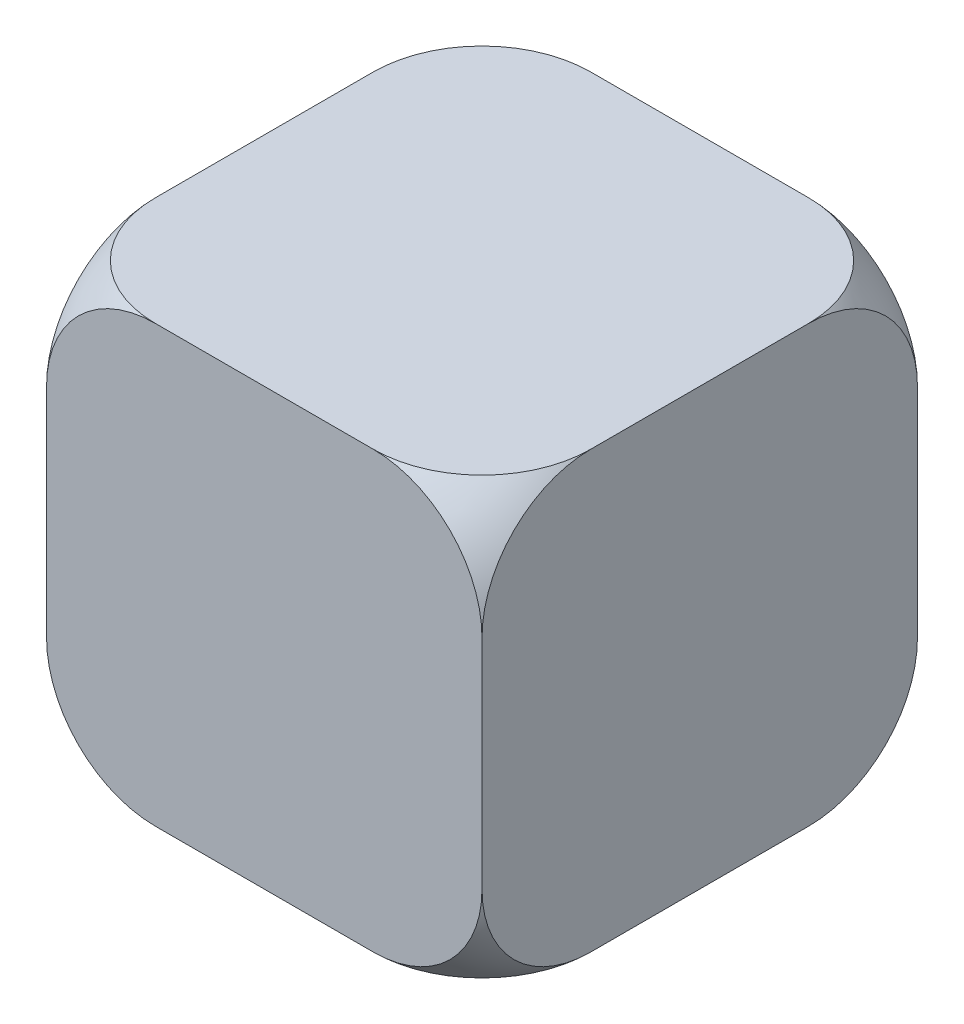
ISO-10303-21;
HEADER;
FILE_DESCRIPTION(('STEP AP214'),'2;1');
FILE_NAME('part.step','',(''),(''),'','','');
FILE_SCHEMA(('AUTOMOTIVE_DESIGN { 1 0 10303 214 1 1 1 1 }'));
ENDSEC;
DATA;
#1=APPLICATION_CONTEXT('core data for automotive mechanical design processes');
#2=APPLICATION_PROTOCOL_DEFINITION('international standard','automotive_design',2000,#1);
#3=PRODUCT_CONTEXT('',#1,'mechanical');
#4=PRODUCT('Part','Part','',(#3));
#5=PRODUCT_RELATED_PRODUCT_CATEGORY('part','',(#4));
#6=PRODUCT_DEFINITION_FORMATION('','',#4);
#7=PRODUCT_DEFINITION_CONTEXT('part definition',#1,'design');
#8=PRODUCT_DEFINITION('design','',#6,#7);
#9=PRODUCT_DEFINITION_SHAPE('','',#8);
#10=(LENGTH_UNIT() NAMED_UNIT(*) SI_UNIT(.MILLI.,.METRE.));
#11=(NAMED_UNIT(*) PLANE_ANGLE_UNIT() SI_UNIT($,.RADIAN.));
#12=(NAMED_UNIT(*) SI_UNIT($,.STERADIAN.) SOLID_ANGLE_UNIT());
#13=UNCERTAINTY_MEASURE_WITH_UNIT(LENGTH_MEASURE(1.E-05),#10,'distance_accuracy_value','');
#14=(GEOMETRIC_REPRESENTATION_CONTEXT(3) GLOBAL_UNCERTAINTY_ASSIGNED_CONTEXT((#13)) GLOBAL_UNIT_ASSIGNED_CONTEXT((#10,
#11,#12)) REPRESENTATION_CONTEXT('',''));
#15=CARTESIAN_POINT('',(0.,0.,0.));
#16=DIRECTION('',(0.,0.,1.));
#17=DIRECTION('',(1.,0.,0.));
#18=AXIS2_PLACEMENT_3D('',#15,#16,#17);
#19=CARTESIAN_POINT('',(0.,0.,-1.03553390593274));
#20=DIRECTION('',(-1.,0.,0.));
#21=DIRECTION('',(0.,-1.,0.));
#22=AXIS2_PLACEMENT_3D('',#19,#20,#21);
#23=PLANE('',#22);
#24=DIRECTION('',(0.,-1.,0.));
#25=VECTOR('',#24,1.);
#26=CARTESIAN_POINT('',(0.,7.5,0.));
#27=LINE('',#26,#25);
#28=CARTESIAN_POINT('',(0.,7.5,0.));
#29=VERTEX_POINT('',#28);
#30=CARTESIAN_POINT('',(0.,2.5,0.));
#31=VERTEX_POINT('',#30);
#32=EDGE_CURVE('E119',#29,#31,#27,.T.);
#33=ORIENTED_EDGE('',*,*,#32,.T.);
#34=CARTESIAN_POINT('',(0.,2.5,2.5));
#35=DIRECTION('',(-1.,0.,0.));
#36=DIRECTION('',(0.,-1.,0.));
#37=AXIS2_PLACEMENT_3D('',#34,#35,#36);
#38=CIRCLE('',#37,2.5);
#39=CARTESIAN_POINT('',(0.,0.,2.5));
#40=VERTEX_POINT('',#39);
#41=EDGE_CURVE('E102',#31,#40,#38,.T.);
#42=ORIENTED_EDGE('',*,*,#41,.T.);
#43=DIRECTION('',(0.,0.,-1.));
#44=VECTOR('',#43,1.);
#45=CARTESIAN_POINT('',(0.,0.,7.5));
#46=LINE('',#45,#44);
#47=CARTESIAN_POINT('',(0.,0.,7.5));
#48=VERTEX_POINT('',#47);
#49=EDGE_CURVE('E48',#48,#40,#46,.T.);
#50=ORIENTED_EDGE('',*,*,#49,.F.);
#51=CARTESIAN_POINT('',(0.,2.5,7.5));
#52=DIRECTION('',(-1.,0.,0.));
#53=DIRECTION('',(0.,-1.,0.));
#54=AXIS2_PLACEMENT_3D('',#51,#52,#53);
#55=CIRCLE('',#54,2.5);
#56=CARTESIAN_POINT('',(0.,2.5,10.));
#57=VERTEX_POINT('',#56);
#58=EDGE_CURVE('E225',#48,#57,#55,.T.);
#59=ORIENTED_EDGE('',*,*,#58,.T.);
#60=DIRECTION('',(0.,-1.,0.));
#61=VECTOR('',#60,1.);
#62=CARTESIAN_POINT('',(0.,7.5,10.));
#63=LINE('',#62,#61);
#64=CARTESIAN_POINT('',(0.,7.5,10.));
#65=VERTEX_POINT('',#64);
#66=EDGE_CURVE('E180',#65,#57,#63,.T.);
#67=ORIENTED_EDGE('',*,*,#66,.F.);
#68=CARTESIAN_POINT('',(0.,7.5,7.5));
#69=DIRECTION('',(-1.,0.,0.));
#70=DIRECTION('',(0.,-1.,0.));
#71=AXIS2_PLACEMENT_3D('',#68,#69,#70);
#72=CIRCLE('',#71,2.5);
#73=CARTESIAN_POINT('',(0.,10.,7.5));
#74=VERTEX_POINT('',#73);
#75=EDGE_CURVE('E210',#65,#74,#72,.T.);
#76=ORIENTED_EDGE('',*,*,#75,.T.);
#77=DIRECTION('',(0.,0.,-1.));
#78=VECTOR('',#77,1.);
#79=CARTESIAN_POINT('',(0.,10.,7.5));
#80=LINE('',#79,#78);
#81=CARTESIAN_POINT('',(0.,10.,2.5));
#82=VERTEX_POINT('',#81);
#83=EDGE_CURVE('E95',#74,#82,#80,.T.);
#84=ORIENTED_EDGE('',*,*,#83,.T.);
#85=CARTESIAN_POINT('',(0.,7.5,2.5));
#86=DIRECTION('',(-1.,0.,0.));
#87=DIRECTION('',(0.,-1.,0.));
#88=AXIS2_PLACEMENT_3D('',#85,#86,#87);
#89=CIRCLE('',#88,2.5);
#90=EDGE_CURVE('E215',#82,#29,#89,.T.);
#91=ORIENTED_EDGE('',*,*,#90,.T.);
#92=EDGE_LOOP('',(#33,#42,#50,#59,#67,#76,#84,#91));
#93=FACE_BOUND('',#92,.T.);
#94=ADVANCED_FACE('F33',(#93),#23,.T.);
#95=CARTESIAN_POINT('',(0.,0.,-1.03553390593274));
#96=DIRECTION('',(0.,-1.,0.));
#97=DIRECTION('',(1.,0.,0.));
#98=AXIS2_PLACEMENT_3D('',#95,#96,#97);
#99=PLANE('',#98);
#100=CARTESIAN_POINT('',(2.5,0.,2.5));
#101=DIRECTION('',(0.,-1.,0.));
#102=DIRECTION('',(1.,0.,0.));
#103=AXIS2_PLACEMENT_3D('',#100,#101,#102);
#104=CIRCLE('',#103,2.5);
#105=CARTESIAN_POINT('',(2.5,0.,0.));
#106=VERTEX_POINT('',#105);
#107=EDGE_CURVE('E41',#40,#106,#104,.T.);
#108=ORIENTED_EDGE('',*,*,#107,.T.);
#109=DIRECTION('',(-1.,0.,0.));
#110=VECTOR('',#109,1.);
#111=CARTESIAN_POINT('',(7.5,0.,0.));
#112=LINE('',#111,#110);
#113=CARTESIAN_POINT('',(7.5,0.,0.));
#114=VERTEX_POINT('',#113);
#115=EDGE_CURVE('E86',#114,#106,#112,.T.);
#116=ORIENTED_EDGE('',*,*,#115,.F.);
#117=CARTESIAN_POINT('',(7.5,0.,2.5));
#118=DIRECTION('',(0.,-1.,0.));
#119=DIRECTION('',(1.,0.,0.));
#120=AXIS2_PLACEMENT_3D('',#117,#118,#119);
#121=CIRCLE('',#120,2.49999999999999);
#122=CARTESIAN_POINT('',(9.99999999999999,0.,2.5));
#123=VERTEX_POINT('',#122);
#124=EDGE_CURVE('E71',#114,#123,#121,.T.);
#125=ORIENTED_EDGE('',*,*,#124,.T.);
#126=DIRECTION('',(0.,0.,-1.));
#127=VECTOR('',#126,1.);
#128=CARTESIAN_POINT('',(9.99999999999999,0.,7.5));
#129=LINE('',#128,#127);
#130=CARTESIAN_POINT('',(10.,0.,7.5));
#131=VERTEX_POINT('',#130);
#132=EDGE_CURVE('E83',#131,#123,#129,.T.);
#133=ORIENTED_EDGE('',*,*,#132,.F.);
#134=CARTESIAN_POINT('',(7.5,0.,7.5));
#135=DIRECTION('',(0.,-1.,0.));
#136=DIRECTION('',(1.,0.,0.));
#137=AXIS2_PLACEMENT_3D('',#134,#135,#136);
#138=CIRCLE('',#137,2.49999999999999);
#139=CARTESIAN_POINT('',(7.5,0.,10.));
#140=VERTEX_POINT('',#139);
#141=EDGE_CURVE('E173',#131,#140,#138,.T.);
#142=ORIENTED_EDGE('',*,*,#141,.T.);
#143=DIRECTION('',(-1.,0.,0.));
#144=VECTOR('',#143,1.);
#145=CARTESIAN_POINT('',(7.5,0.,10.));
#146=LINE('',#145,#144);
#147=CARTESIAN_POINT('',(2.5,0.,10.));
#148=VERTEX_POINT('',#147);
#149=EDGE_CURVE('E171',#140,#148,#146,.T.);
#150=ORIENTED_EDGE('',*,*,#149,.T.);
#151=CARTESIAN_POINT('',(2.5,0.,7.5));
#152=DIRECTION('',(0.,-1.,0.));
#153=DIRECTION('',(1.,0.,0.));
#154=AXIS2_PLACEMENT_3D('',#151,#152,#153);
#155=CIRCLE('',#154,2.5);
#156=EDGE_CURVE('E176',#148,#48,#155,.T.);
#157=ORIENTED_EDGE('',*,*,#156,.T.);
#158=ORIENTED_EDGE('',*,*,#49,.T.);
#159=EDGE_LOOP('',(#108,#116,#125,#133,#142,#150,#157,#158));
#160=FACE_BOUND('',#159,.T.);
#161=ADVANCED_FACE('F35',(#160),#99,.T.);
#162=CARTESIAN_POINT('',(2.5,2.5,2.5));
#163=DIRECTION('',(1.,0.,0.));
#164=DIRECTION('',(0.,-1.,0.));
#165=AXIS2_PLACEMENT_3D('',#162,#163,#164);
#166=SPHERICAL_SURFACE('',#165,3.53553390593274);
#167=ORIENTED_EDGE('',*,*,#41,.F.);
#168=CARTESIAN_POINT('',(2.5,2.50000000000001,0.));
#169=DIRECTION('',(0.,0.,1.));
#170=DIRECTION('',(0.,-1.,0.));
#171=AXIS2_PLACEMENT_3D('',#168,#169,#170);
#172=CIRCLE('',#171,2.5);
#173=EDGE_CURVE('E11',#31,#106,#172,.T.);
#174=ORIENTED_EDGE('',*,*,#173,.T.);
#175=ORIENTED_EDGE('',*,*,#107,.F.);
#176=EDGE_LOOP('',(#167,#174,#175));
#177=FACE_BOUND('',#176,.T.);
#178=ADVANCED_FACE('F110',(#177),#166,.T.);
#179=CARTESIAN_POINT('',(20.,0.,0.));
#180=DIRECTION('',(0.,0.,1.));
#181=DIRECTION('',(0.,-1.,0.));
#182=AXIS2_PLACEMENT_3D('',#179,#180,#181);
#183=PLANE('',#182);
#184=ORIENTED_EDGE('',*,*,#173,.F.);
#185=ORIENTED_EDGE('',*,*,#32,.F.);
#186=CARTESIAN_POINT('',(2.5,7.49999999999999,0.));
#187=DIRECTION('',(0.,0.,1.));
#188=DIRECTION('',(0.,-1.,0.));
#189=AXIS2_PLACEMENT_3D('',#186,#187,#188);
#190=CIRCLE('',#189,2.5);
#191=CARTESIAN_POINT('',(2.5,10.,0.));
#192=VERTEX_POINT('',#191);
#193=EDGE_CURVE('E220',#192,#29,#190,.T.);
#194=ORIENTED_EDGE('',*,*,#193,.F.);
#195=DIRECTION('',(-1.,0.,0.));
#196=VECTOR('',#195,1.);
#197=CARTESIAN_POINT('',(7.5,10.,0.));
#198=LINE('',#197,#196);
#199=CARTESIAN_POINT('',(7.5,10.,0.));
#200=VERTEX_POINT('',#199);
#201=EDGE_CURVE('E189',#200,#192,#198,.T.);
#202=ORIENTED_EDGE('',*,*,#201,.F.);
#203=CARTESIAN_POINT('',(7.5,7.49999999999999,0.));
#204=DIRECTION('',(0.,0.,1.));
#205=DIRECTION('',(0.,-1.,0.));
#206=AXIS2_PLACEMENT_3D('',#203,#204,#205);
#207=CIRCLE('',#206,2.5);
#208=CARTESIAN_POINT('',(10.,7.5,0.));
#209=VERTEX_POINT('',#208);
#210=EDGE_CURVE('E199',#209,#200,#207,.T.);
#211=ORIENTED_EDGE('',*,*,#210,.F.);
#212=DIRECTION('',(0.,-1.,0.));
#213=VECTOR('',#212,1.);
#214=CARTESIAN_POINT('',(10.,7.5,0.));
#215=LINE('',#214,#213);
#216=CARTESIAN_POINT('',(10.,2.5,0.));
#217=VERTEX_POINT('',#216);
#218=EDGE_CURVE('E185',#209,#217,#215,.T.);
#219=ORIENTED_EDGE('',*,*,#218,.T.);
#220=CARTESIAN_POINT('',(7.5,2.50000000000001,0.));
#221=DIRECTION('',(0.,0.,1.));
#222=DIRECTION('',(0.,-1.,0.));
#223=AXIS2_PLACEMENT_3D('',#220,#221,#222);
#224=CIRCLE('',#223,2.5);
#225=EDGE_CURVE('E73',#114,#217,#224,.T.);
#226=ORIENTED_EDGE('',*,*,#225,.F.);
#227=ORIENTED_EDGE('',*,*,#115,.T.);
#228=EDGE_LOOP('',(#184,#185,#194,#202,#211,#219,#226,#227));
#229=FACE_BOUND('',#228,.T.);
#230=ADVANCED_FACE('F115',(#229),#183,.F.);
#231=CARTESIAN_POINT('',(9.99999999999999,10.,7.5));
#232=DIRECTION('',(-1.,0.,0.));
#233=DIRECTION('',(0.,0.,1.));
#234=AXIS2_PLACEMENT_3D('',#231,#232,#233);
#235=PLANE('',#234);
#236=CARTESIAN_POINT('',(10.,7.5,7.5));
#237=DIRECTION('',(1.,0.,0.));
#238=DIRECTION('',(0.,1.,0.));
#239=AXIS2_PLACEMENT_3D('',#236,#237,#238);
#240=CIRCLE('',#239,2.5);
#241=CARTESIAN_POINT('',(9.99999999999999,10.,7.5));
#242=VERTEX_POINT('',#241);
#243=CARTESIAN_POINT('',(10.,7.5,9.99999999999999));
#244=VERTEX_POINT('',#243);
#245=EDGE_CURVE('E179',#242,#244,#240,.T.);
#246=ORIENTED_EDGE('',*,*,#245,.T.);
#247=DIRECTION('',(0.,-1.,0.));
#248=VECTOR('',#247,1.);
#249=CARTESIAN_POINT('',(10.,7.5,10.));
#250=LINE('',#249,#248);
#251=CARTESIAN_POINT('',(10.,2.5,9.99999999999999));
#252=VERTEX_POINT('',#251);
#253=EDGE_CURVE('E169',#244,#252,#250,.T.);
#254=ORIENTED_EDGE('',*,*,#253,.T.);
#255=CARTESIAN_POINT('',(10.,2.5,7.5));
#256=DIRECTION('',(1.,0.,0.));
#257=DIRECTION('',(0.,0.,-1.));
#258=AXIS2_PLACEMENT_3D('',#255,#256,#257);
#259=CIRCLE('',#258,2.49999999999999);
#260=EDGE_CURVE('E92',#252,#131,#259,.T.);
#261=ORIENTED_EDGE('',*,*,#260,.T.);
#262=ORIENTED_EDGE('',*,*,#132,.T.);
#263=CARTESIAN_POINT('',(10.,2.5,2.5));
#264=DIRECTION('',(1.,0.,0.));
#265=DIRECTION('',(0.,0.,-1.));
#266=AXIS2_PLACEMENT_3D('',#263,#264,#265);
#267=CIRCLE('',#266,2.49999999999999);
#268=EDGE_CURVE('E67',#123,#217,#267,.T.);
#269=ORIENTED_EDGE('',*,*,#268,.T.);
#270=ORIENTED_EDGE('',*,*,#218,.F.);
#271=CARTESIAN_POINT('',(10.,7.5,2.5));
#272=DIRECTION('',(1.,0.,0.));
#273=DIRECTION('',(0.,1.,0.));
#274=AXIS2_PLACEMENT_3D('',#271,#272,#273);
#275=CIRCLE('',#274,2.5);
#276=CARTESIAN_POINT('',(10.,10.,2.5));
#277=VERTEX_POINT('',#276);
#278=EDGE_CURVE('E202',#209,#277,#275,.T.);
#279=ORIENTED_EDGE('',*,*,#278,.T.);
#280=DIRECTION('',(0.,0.,-1.));
#281=VECTOR('',#280,1.);
#282=CARTESIAN_POINT('',(9.99999999999999,10.,7.5));
#283=LINE('',#282,#281);
#284=EDGE_CURVE('E99',#242,#277,#283,.T.);
#285=ORIENTED_EDGE('',*,*,#284,.F.);
#286=EDGE_LOOP('',(#246,#254,#261,#262,#269,#270,#279,#285));
#287=FACE_BOUND('',#286,.T.);
#288=ADVANCED_FACE('F89',(#287),#235,.F.);
#289=CARTESIAN_POINT('',(9.99999999999999,10.,7.5));
#290=DIRECTION('',(0.,-1.,0.));
#291=DIRECTION('',(0.,0.,-1.));
#292=AXIS2_PLACEMENT_3D('',#289,#290,#291);
#293=PLANE('',#292);
#294=CARTESIAN_POINT('',(7.5,10.,2.5));
#295=DIRECTION('',(0.,1.,0.));
#296=DIRECTION('',(-1.,0.,0.));
#297=AXIS2_PLACEMENT_3D('',#294,#295,#296);
#298=CIRCLE('',#297,2.49999999999999);
#299=EDGE_CURVE('E204',#277,#200,#298,.T.);
#300=ORIENTED_EDGE('',*,*,#299,.T.);
#301=ORIENTED_EDGE('',*,*,#201,.T.);
#302=CARTESIAN_POINT('',(2.5,10.,2.5));
#303=DIRECTION('',(0.,1.,0.));
#304=DIRECTION('',(0.,0.,1.));
#305=AXIS2_PLACEMENT_3D('',#302,#303,#304);
#306=CIRCLE('',#305,2.5);
#307=EDGE_CURVE('E217',#192,#82,#306,.T.);
#308=ORIENTED_EDGE('',*,*,#307,.T.);
#309=ORIENTED_EDGE('',*,*,#83,.F.);
#310=CARTESIAN_POINT('',(2.5,10.,7.5));
#311=DIRECTION('',(0.,1.,0.));
#312=DIRECTION('',(0.,0.,1.));
#313=AXIS2_PLACEMENT_3D('',#310,#311,#312);
#314=CIRCLE('',#313,2.5);
#315=CARTESIAN_POINT('',(2.5,10.,10.));
#316=VERTEX_POINT('',#315);
#317=EDGE_CURVE('E212',#74,#316,#314,.T.);
#318=ORIENTED_EDGE('',*,*,#317,.T.);
#319=DIRECTION('',(-1.,0.,0.));
#320=VECTOR('',#319,1.);
#321=CARTESIAN_POINT('',(7.5,10.,10.));
#322=LINE('',#321,#320);
#323=CARTESIAN_POINT('',(7.5,10.,10.));
#324=VERTEX_POINT('',#323);
#325=EDGE_CURVE('E187',#324,#316,#322,.T.);
#326=ORIENTED_EDGE('',*,*,#325,.F.);
#327=CARTESIAN_POINT('',(7.5,10.,7.5));
#328=DIRECTION('',(0.,1.,0.));
#329=DIRECTION('',(-1.,0.,0.));
#330=AXIS2_PLACEMENT_3D('',#327,#328,#329);
#331=CIRCLE('',#330,2.49999999999999);
#332=EDGE_CURVE('E194',#324,#242,#331,.T.);
#333=ORIENTED_EDGE('',*,*,#332,.T.);
#334=ORIENTED_EDGE('',*,*,#284,.T.);
#335=EDGE_LOOP('',(#300,#301,#308,#309,#318,#326,#333,#334));
#336=FACE_BOUND('',#335,.T.);
#337=ADVANCED_FACE('F240',(#336),#293,.F.);
#338=CARTESIAN_POINT('',(7.5,2.5,2.5));
#339=DIRECTION('',(1.,0.,0.));
#340=DIRECTION('',(0.,-1.,0.));
#341=AXIS2_PLACEMENT_3D('',#338,#339,#340);
#342=SPHERICAL_SURFACE('',#341,3.53553390593273);
#343=ORIENTED_EDGE('',*,*,#124,.F.);
#344=ORIENTED_EDGE('',*,*,#225,.T.);
#345=ORIENTED_EDGE('',*,*,#268,.F.);
#346=EDGE_LOOP('',(#343,#344,#345));
#347=FACE_BOUND('',#346,.T.);
#348=ADVANCED_FACE('F69',(#347),#342,.T.);
#349=CARTESIAN_POINT('',(7.5,2.5,7.5));
#350=DIRECTION('',(1.,0.,0.));
#351=DIRECTION('',(0.,-1.,0.));
#352=AXIS2_PLACEMENT_3D('',#349,#350,#351);
#353=SPHERICAL_SURFACE('',#352,3.53553390593273);
#354=ORIENTED_EDGE('',*,*,#260,.F.);
#355=CARTESIAN_POINT('',(7.5,2.50000000000001,9.99999999999999));
#356=DIRECTION('',(0.,0.,-1.));
#357=DIRECTION('',(0.,1.,0.));
#358=AXIS2_PLACEMENT_3D('',#355,#356,#357);
#359=CIRCLE('',#358,2.5);
#360=EDGE_CURVE('E165',#252,#140,#359,.T.);
#361=ORIENTED_EDGE('',*,*,#360,.T.);
#362=ORIENTED_EDGE('',*,*,#141,.F.);
#363=EDGE_LOOP('',(#354,#361,#362));
#364=FACE_BOUND('',#363,.T.);
#365=ADVANCED_FACE('F175',(#364),#353,.T.);
#366=CARTESIAN_POINT('',(20.,0.,10.));
#367=DIRECTION('',(0.,0.,-1.));
#368=DIRECTION('',(0.,1.,0.));
#369=AXIS2_PLACEMENT_3D('',#366,#367,#368);
#370=PLANE('',#369);
#371=CARTESIAN_POINT('',(2.5,7.49999999999999,9.99999999999999));
#372=DIRECTION('',(0.,0.,-1.));
#373=DIRECTION('',(0.,1.,0.));
#374=AXIS2_PLACEMENT_3D('',#371,#372,#373);
#375=CIRCLE('',#374,2.5);
#376=EDGE_CURVE('E207',#65,#316,#375,.T.);
#377=ORIENTED_EDGE('',*,*,#376,.F.);
#378=ORIENTED_EDGE('',*,*,#66,.T.);
#379=CARTESIAN_POINT('',(2.5,2.50000000000001,9.99999999999999));
#380=DIRECTION('',(0.,0.,-1.));
#381=DIRECTION('',(0.,1.,0.));
#382=AXIS2_PLACEMENT_3D('',#379,#380,#381);
#383=CIRCLE('',#382,2.5);
#384=EDGE_CURVE('E222',#148,#57,#383,.T.);
#385=ORIENTED_EDGE('',*,*,#384,.F.);
#386=ORIENTED_EDGE('',*,*,#149,.F.);
#387=ORIENTED_EDGE('',*,*,#360,.F.);
#388=ORIENTED_EDGE('',*,*,#253,.F.);
#389=CARTESIAN_POINT('',(7.5,7.49999999999999,9.99999999999999));
#390=DIRECTION('',(0.,0.,-1.));
#391=DIRECTION('',(0.,1.,0.));
#392=AXIS2_PLACEMENT_3D('',#389,#390,#391);
#393=CIRCLE('',#392,2.5);
#394=EDGE_CURVE('E197',#324,#244,#393,.T.);
#395=ORIENTED_EDGE('',*,*,#394,.F.);
#396=ORIENTED_EDGE('',*,*,#325,.T.);
#397=EDGE_LOOP('',(#377,#378,#385,#386,#387,#388,#395,#396));
#398=FACE_BOUND('',#397,.T.);
#399=ADVANCED_FACE('F167',(#398),#370,.F.);
#400=CARTESIAN_POINT('',(2.5,2.5,7.5));
#401=DIRECTION('',(1.,0.,0.));
#402=DIRECTION('',(0.,-1.,0.));
#403=AXIS2_PLACEMENT_3D('',#400,#401,#402);
#404=SPHERICAL_SURFACE('',#403,3.53553390593274);
#405=ORIENTED_EDGE('',*,*,#156,.F.);
#406=ORIENTED_EDGE('',*,*,#384,.T.);
#407=ORIENTED_EDGE('',*,*,#58,.F.);
#408=EDGE_LOOP('',(#405,#406,#407));
#409=FACE_BOUND('',#408,.T.);
#410=ADVANCED_FACE('F233',(#409),#404,.T.);
#411=CARTESIAN_POINT('',(2.5,7.5,2.5));
#412=DIRECTION('',(1.,0.,0.));
#413=DIRECTION('',(0.,-1.,0.));
#414=AXIS2_PLACEMENT_3D('',#411,#412,#413);
#415=SPHERICAL_SURFACE('',#414,3.53553390593274);
#416=ORIENTED_EDGE('',*,*,#307,.F.);
#417=ORIENTED_EDGE('',*,*,#193,.T.);
#418=ORIENTED_EDGE('',*,*,#90,.F.);
#419=EDGE_LOOP('',(#416,#417,#418));
#420=FACE_BOUND('',#419,.T.);
#421=ADVANCED_FACE('F244',(#420),#415,.T.);
#422=CARTESIAN_POINT('',(2.5,7.5,7.5));
#423=DIRECTION('',(1.,0.,0.));
#424=DIRECTION('',(0.,-1.,0.));
#425=AXIS2_PLACEMENT_3D('',#422,#423,#424);
#426=SPHERICAL_SURFACE('',#425,3.53553390593274);
#427=ORIENTED_EDGE('',*,*,#75,.F.);
#428=ORIENTED_EDGE('',*,*,#376,.T.);
#429=ORIENTED_EDGE('',*,*,#317,.F.);
#430=EDGE_LOOP('',(#427,#428,#429));
#431=FACE_BOUND('',#430,.T.);
#432=ADVANCED_FACE('F237',(#431),#426,.T.);
#433=CARTESIAN_POINT('',(7.5,7.5,2.5));
#434=DIRECTION('',(1.,0.,0.));
#435=DIRECTION('',(0.,-1.,0.));
#436=AXIS2_PLACEMENT_3D('',#433,#434,#435);
#437=SPHERICAL_SURFACE('',#436,3.53553390593273);
#438=ORIENTED_EDGE('',*,*,#278,.F.);
#439=ORIENTED_EDGE('',*,*,#210,.T.);
#440=ORIENTED_EDGE('',*,*,#299,.F.);
#441=EDGE_LOOP('',(#438,#439,#440));
#442=FACE_BOUND('',#441,.T.);
#443=ADVANCED_FACE('F248',(#442),#437,.T.);
#444=CARTESIAN_POINT('',(7.5,7.5,7.5));
#445=DIRECTION('',(1.,0.,0.));
#446=DIRECTION('',(0.,-1.,0.));
#447=AXIS2_PLACEMENT_3D('',#444,#445,#446);
#448=SPHERICAL_SURFACE('',#447,3.53553390593273);
#449=ORIENTED_EDGE('',*,*,#332,.F.);
#450=ORIENTED_EDGE('',*,*,#394,.T.);
#451=ORIENTED_EDGE('',*,*,#245,.F.);
#452=EDGE_LOOP('',(#449,#450,#451));
#453=FACE_BOUND('',#452,.T.);
#454=ADVANCED_FACE('F251',(#453),#448,.T.);
#455=CLOSED_SHELL('',(#94,#161,#178,#230,#288,#337,#348,#365,#399,#410,#421,#432,#443,#454));
#456=MANIFOLD_SOLID_BREP('B2',#455);
#457=ADVANCED_BREP_SHAPE_REPRESENTATION('',(#18,#456),#14);
#458=SHAPE_DEFINITION_REPRESENTATION(#9,#457);
ENDSEC;
END-ISO-10303-21;
